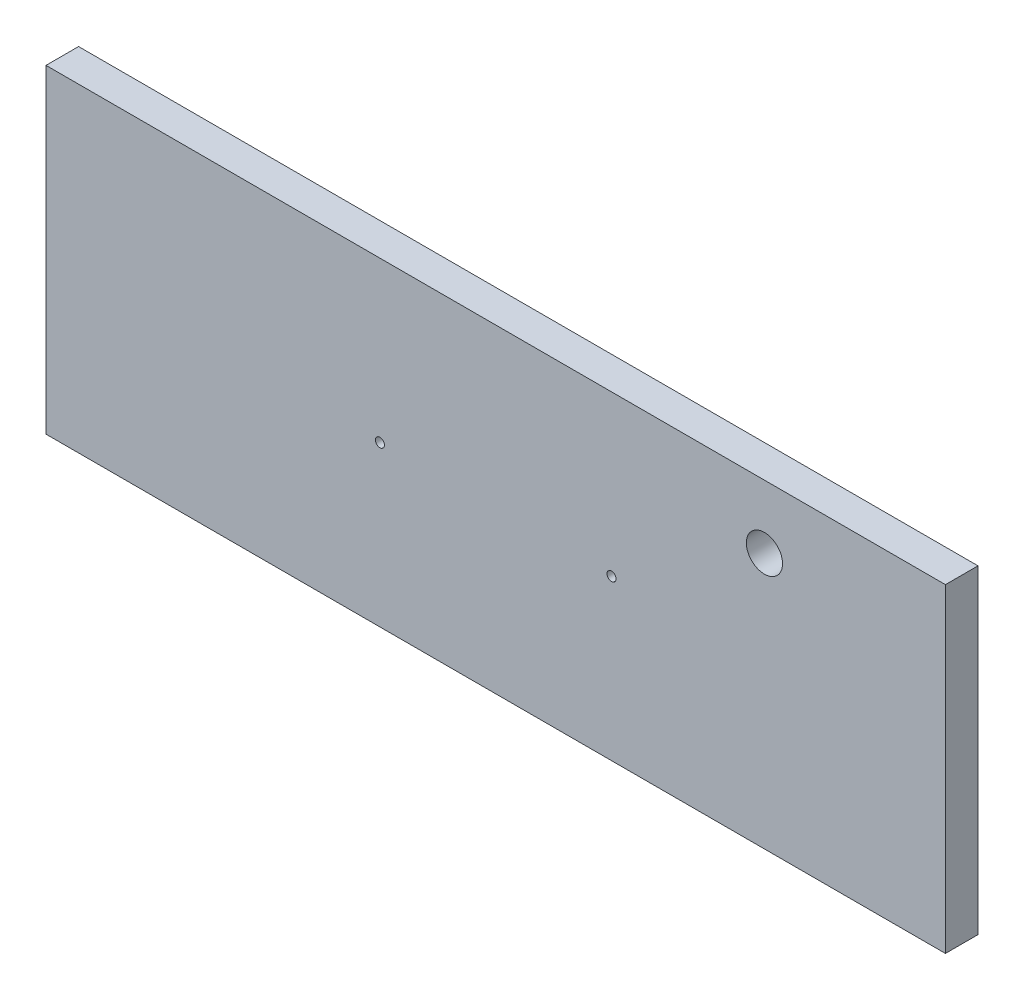
ISO-10303-21;
HEADER;
FILE_DESCRIPTION(('STEP AP214'),'2;1');
FILE_NAME('part.step','',(''),(''),'','','');
FILE_SCHEMA(('AUTOMOTIVE_DESIGN { 1 0 10303 214 1 1 1 1 }'));
ENDSEC;
DATA;
#1=APPLICATION_CONTEXT('core data for automotive mechanical design processes');
#2=APPLICATION_PROTOCOL_DEFINITION('international standard','automotive_design',2000,#1);
#3=PRODUCT_CONTEXT('',#1,'mechanical');
#4=PRODUCT('Part','Part','',(#3));
#5=PRODUCT_RELATED_PRODUCT_CATEGORY('part','',(#4));
#6=PRODUCT_DEFINITION_FORMATION('','',#4);
#7=PRODUCT_DEFINITION_CONTEXT('part definition',#1,'design');
#8=PRODUCT_DEFINITION('design','',#6,#7);
#9=PRODUCT_DEFINITION_SHAPE('','',#8);
#10=(LENGTH_UNIT() NAMED_UNIT(*) SI_UNIT(.MILLI.,.METRE.));
#11=(NAMED_UNIT(*) PLANE_ANGLE_UNIT() SI_UNIT($,.RADIAN.));
#12=(NAMED_UNIT(*) SI_UNIT($,.STERADIAN.) SOLID_ANGLE_UNIT());
#13=UNCERTAINTY_MEASURE_WITH_UNIT(LENGTH_MEASURE(1.E-05),#10,'distance_accuracy_value','');
#14=(GEOMETRIC_REPRESENTATION_CONTEXT(3) GLOBAL_UNCERTAINTY_ASSIGNED_CONTEXT((#13)) GLOBAL_UNIT_ASSIGNED_CONTEXT((#10,
#11,#12)) REPRESENTATION_CONTEXT('',''));
#15=CARTESIAN_POINT('',(0.,0.,0.));
#16=DIRECTION('',(0.,0.,1.));
#17=DIRECTION('',(1.,0.,0.));
#18=AXIS2_PLACEMENT_3D('',#15,#16,#17);
#19=CARTESIAN_POINT('',(248.5,-211.5,18.));
#20=DIRECTION('',(-1.,0.,0.));
#21=DIRECTION('',(0.,0.,1.));
#22=AXIS2_PLACEMENT_3D('',#19,#20,#21);
#23=PLANE('',#22);
#24=DIRECTION('',(0.,1.,0.));
#25=VECTOR('',#24,1.);
#26=CARTESIAN_POINT('',(248.5,-211.5,0.));
#27=LINE('',#26,#25);
#28=CARTESIAN_POINT('',(248.5,-211.5,0.));
#29=VERTEX_POINT('',#28);
#30=CARTESIAN_POINT('',(248.5,-35.,0.));
#31=VERTEX_POINT('',#30);
#32=EDGE_CURVE('E96',#29,#31,#27,.T.);
#33=ORIENTED_EDGE('',*,*,#32,.T.);
#34=DIRECTION('',(0.,0.,-1.));
#35=VECTOR('',#34,1.);
#36=CARTESIAN_POINT('',(248.5,-35.,18.));
#37=LINE('',#36,#35);
#38=CARTESIAN_POINT('',(248.5,-35.,18.));
#39=VERTEX_POINT('',#38);
#40=EDGE_CURVE('E11',#39,#31,#37,.T.);
#41=ORIENTED_EDGE('',*,*,#40,.F.);
#42=DIRECTION('',(0.,1.,0.));
#43=VECTOR('',#42,1.);
#44=CARTESIAN_POINT('',(248.5,-211.5,18.));
#45=LINE('',#44,#43);
#46=CARTESIAN_POINT('',(248.5,-211.5,18.));
#47=VERTEX_POINT('',#46);
#48=EDGE_CURVE('E84',#47,#39,#45,.T.);
#49=ORIENTED_EDGE('',*,*,#48,.F.);
#50=DIRECTION('',(0.,0.,-1.));
#51=VECTOR('',#50,1.);
#52=CARTESIAN_POINT('',(248.5,-211.5,18.));
#53=LINE('',#52,#51);
#54=EDGE_CURVE('E92',#47,#29,#53,.T.);
#55=ORIENTED_EDGE('',*,*,#54,.T.);
#56=EDGE_LOOP('',(#33,#41,#49,#55));
#57=FACE_BOUND('',#56,.T.);
#58=ADVANCED_FACE('F33',(#57),#23,.F.);
#59=CARTESIAN_POINT('',(248.5,-35.,18.));
#60=DIRECTION('',(0.,-1.,0.));
#61=DIRECTION('',(1.,0.,0.));
#62=AXIS2_PLACEMENT_3D('',#59,#60,#61);
#63=PLANE('',#62);
#64=DIRECTION('',(-1.,0.,0.));
#65=VECTOR('',#64,1.);
#66=CARTESIAN_POINT('',(248.5,-35.,0.));
#67=LINE('',#66,#65);
#68=CARTESIAN_POINT('',(-248.5,-35.0000000000001,0.));
#69=VERTEX_POINT('',#68);
#70=EDGE_CURVE('E88',#31,#69,#67,.T.);
#71=ORIENTED_EDGE('',*,*,#70,.T.);
#72=DIRECTION('',(0.,0.,-1.));
#73=VECTOR('',#72,1.);
#74=CARTESIAN_POINT('',(-248.5,-35.0000000000001,18.));
#75=LINE('',#74,#73);
#76=CARTESIAN_POINT('',(-248.5,-35.0000000000001,18.));
#77=VERTEX_POINT('',#76);
#78=EDGE_CURVE('E41',#77,#69,#75,.T.);
#79=ORIENTED_EDGE('',*,*,#78,.F.);
#80=DIRECTION('',(-1.,0.,0.));
#81=VECTOR('',#80,1.);
#82=CARTESIAN_POINT('',(248.5,-35.,18.));
#83=LINE('',#82,#81);
#84=EDGE_CURVE('E79',#39,#77,#83,.T.);
#85=ORIENTED_EDGE('',*,*,#84,.F.);
#86=ORIENTED_EDGE('',*,*,#40,.T.);
#87=EDGE_LOOP('',(#71,#79,#85,#86));
#88=FACE_BOUND('',#87,.T.);
#89=ADVANCED_FACE('F87',(#88),#63,.F.);
#90=CARTESIAN_POINT('',(-248.5,-211.5,18.));
#91=DIRECTION('',(1.,0.,0.));
#92=DIRECTION('',(0.,0.,-1.));
#93=AXIS2_PLACEMENT_3D('',#90,#91,#92);
#94=PLANE('',#93);
#95=DIRECTION('',(0.,-1.,0.));
#96=VECTOR('',#95,1.);
#97=CARTESIAN_POINT('',(-248.5,-211.5,0.));
#98=LINE('',#97,#96);
#99=CARTESIAN_POINT('',(-248.5,-211.5,0.));
#100=VERTEX_POINT('',#99);
#101=EDGE_CURVE('E66',#69,#100,#98,.T.);
#102=ORIENTED_EDGE('',*,*,#101,.T.);
#103=DIRECTION('',(0.,0.,-1.));
#104=VECTOR('',#103,1.);
#105=CARTESIAN_POINT('',(-248.5,-211.5,18.));
#106=LINE('',#105,#104);
#107=CARTESIAN_POINT('',(-248.5,-211.5,18.));
#108=VERTEX_POINT('',#107);
#109=EDGE_CURVE('E89',#108,#100,#106,.T.);
#110=ORIENTED_EDGE('',*,*,#109,.F.);
#111=DIRECTION('',(0.,-1.,0.));
#112=VECTOR('',#111,1.);
#113=CARTESIAN_POINT('',(-248.5,-211.5,18.));
#114=LINE('',#113,#112);
#115=EDGE_CURVE('E82',#77,#108,#114,.T.);
#116=ORIENTED_EDGE('',*,*,#115,.F.);
#117=ORIENTED_EDGE('',*,*,#78,.T.);
#118=EDGE_LOOP('',(#102,#110,#116,#117));
#119=FACE_BOUND('',#118,.T.);
#120=ADVANCED_FACE('F90',(#119),#94,.F.);
#121=CARTESIAN_POINT('',(248.5,-211.5,18.));
#122=DIRECTION('',(0.,1.,0.));
#123=DIRECTION('',(-1.,0.,0.));
#124=AXIS2_PLACEMENT_3D('',#121,#122,#123);
#125=PLANE('',#124);
#126=DIRECTION('',(1.,0.,0.));
#127=VECTOR('',#126,1.);
#128=CARTESIAN_POINT('',(248.5,-211.5,0.));
#129=LINE('',#128,#127);
#130=EDGE_CURVE('E72',#100,#29,#129,.T.);
#131=ORIENTED_EDGE('',*,*,#130,.T.);
#132=ORIENTED_EDGE('',*,*,#54,.F.);
#133=DIRECTION('',(1.,0.,0.));
#134=VECTOR('',#133,1.);
#135=CARTESIAN_POINT('',(248.5,-211.5,18.));
#136=LINE('',#135,#134);
#137=EDGE_CURVE('E49',#108,#47,#136,.T.);
#138=ORIENTED_EDGE('',*,*,#137,.F.);
#139=ORIENTED_EDGE('',*,*,#109,.T.);
#140=EDGE_LOOP('',(#131,#132,#138,#139));
#141=FACE_BOUND('',#140,.T.);
#142=ADVANCED_FACE('F104',(#141),#125,.F.);
#143=CARTESIAN_POINT('',(0.,0.,18.));
#144=DIRECTION('',(0.,0.,1.));
#145=DIRECTION('',(1.,0.,0.));
#146=AXIS2_PLACEMENT_3D('',#143,#144,#145);
#147=PLANE('',#146);
#148=CARTESIAN_POINT('',(148.5,-70.,18.));
#149=DIRECTION('',(0.,0.,1.));
#150=DIRECTION('',(1.,0.,0.));
#151=AXIS2_PLACEMENT_3D('',#148,#149,#150);
#152=CIRCLE('',#151,9.99999999999998);
#153=CARTESIAN_POINT('',(158.5,-70.,18.));
#154=VERTEX_POINT('',#153);
#155=EDGE_CURVE('E122',#154,#154,#152,.T.);
#156=ORIENTED_EDGE('',*,*,#155,.F.);
#157=EDGE_LOOP('',(#156));
#158=FACE_BOUND('',#157,.T.);
#159=CARTESIAN_POINT('',(-64.,-123.25,18.));
#160=DIRECTION('',(0.,0.,1.));
#161=DIRECTION('',(-1.,0.,0.));
#162=AXIS2_PLACEMENT_3D('',#159,#160,#161);
#163=CIRCLE('',#162,2.49999999999976);
#164=CARTESIAN_POINT('',(-66.4999999999997,-123.25,18.));
#165=VERTEX_POINT('',#164);
#166=EDGE_CURVE('E116',#165,#165,#163,.T.);
#167=ORIENTED_EDGE('',*,*,#166,.F.);
#168=EDGE_LOOP('',(#167));
#169=FACE_BOUND('',#168,.T.);
#170=CARTESIAN_POINT('',(64.,-123.25,18.));
#171=DIRECTION('',(0.,0.,1.));
#172=DIRECTION('',(1.,0.,0.));
#173=AXIS2_PLACEMENT_3D('',#170,#171,#172);
#174=CIRCLE('',#173,2.49999999999981);
#175=CARTESIAN_POINT('',(66.4999999999998,-123.25,18.));
#176=VERTEX_POINT('',#175);
#177=EDGE_CURVE('E110',#176,#176,#174,.T.);
#178=ORIENTED_EDGE('',*,*,#177,.F.);
#179=EDGE_LOOP('',(#178));
#180=FACE_BOUND('',#179,.T.);
#181=ORIENTED_EDGE('',*,*,#48,.T.);
#182=ORIENTED_EDGE('',*,*,#84,.T.);
#183=ORIENTED_EDGE('',*,*,#115,.T.);
#184=ORIENTED_EDGE('',*,*,#137,.T.);
#185=EDGE_LOOP('',(#181,#182,#183,#184));
#186=FACE_BOUND('',#185,.T.);
#187=ADVANCED_FACE('F80',(#158,#169,#180,#186),#147,.T.);
#188=CARTESIAN_POINT('',(0.,0.,0.));
#189=DIRECTION('',(0.,0.,1.));
#190=DIRECTION('',(1.,0.,0.));
#191=AXIS2_PLACEMENT_3D('',#188,#189,#190);
#192=PLANE('',#191);
#193=CARTESIAN_POINT('',(148.5,-70.,0.));
#194=DIRECTION('',(0.,0.,1.));
#195=DIRECTION('',(1.,0.,0.));
#196=AXIS2_PLACEMENT_3D('',#193,#194,#195);
#197=CIRCLE('',#196,9.99999999999998);
#198=CARTESIAN_POINT('',(158.5,-70.,0.));
#199=VERTEX_POINT('',#198);
#200=EDGE_CURVE('E119',#199,#199,#197,.T.);
#201=ORIENTED_EDGE('',*,*,#200,.T.);
#202=EDGE_LOOP('',(#201));
#203=FACE_BOUND('',#202,.T.);
#204=CARTESIAN_POINT('',(-64.,-123.25,0.));
#205=DIRECTION('',(0.,0.,1.));
#206=DIRECTION('',(-1.,0.,0.));
#207=AXIS2_PLACEMENT_3D('',#204,#205,#206);
#208=CIRCLE('',#207,2.49999999999976);
#209=CARTESIAN_POINT('',(-66.4999999999997,-123.25,0.));
#210=VERTEX_POINT('',#209);
#211=EDGE_CURVE('E113',#210,#210,#208,.T.);
#212=ORIENTED_EDGE('',*,*,#211,.T.);
#213=EDGE_LOOP('',(#212));
#214=FACE_BOUND('',#213,.T.);
#215=CARTESIAN_POINT('',(64.,-123.25,0.));
#216=DIRECTION('',(0.,0.,1.));
#217=DIRECTION('',(1.,0.,0.));
#218=AXIS2_PLACEMENT_3D('',#215,#216,#217);
#219=CIRCLE('',#218,2.49999999999981);
#220=CARTESIAN_POINT('',(66.4999999999998,-123.25,0.));
#221=VERTEX_POINT('',#220);
#222=EDGE_CURVE('E99',#221,#221,#219,.T.);
#223=ORIENTED_EDGE('',*,*,#222,.T.);
#224=EDGE_LOOP('',(#223));
#225=FACE_BOUND('',#224,.T.);
#226=ORIENTED_EDGE('',*,*,#32,.F.);
#227=ORIENTED_EDGE('',*,*,#130,.F.);
#228=ORIENTED_EDGE('',*,*,#101,.F.);
#229=ORIENTED_EDGE('',*,*,#70,.F.);
#230=EDGE_LOOP('',(#226,#227,#228,#229));
#231=FACE_BOUND('',#230,.T.);
#232=ADVANCED_FACE('F107',(#203,#214,#225,#231),#192,.F.);
#233=CARTESIAN_POINT('',(64.,-123.25,0.));
#234=DIRECTION('',(0.,0.,1.));
#235=DIRECTION('',(1.,0.,0.));
#236=AXIS2_PLACEMENT_3D('',#233,#234,#235);
#237=CYLINDRICAL_SURFACE('',#236,2.49999999999981);
#238=ORIENTED_EDGE('',*,*,#222,.F.);
#239=EDGE_LOOP('',(#238));
#240=FACE_BOUND('',#239,.T.);
#241=ORIENTED_EDGE('',*,*,#177,.T.);
#242=EDGE_LOOP('',(#241));
#243=FACE_BOUND('',#242,.T.);
#244=ADVANCED_FACE('F144',(#240,#243),#237,.F.);
#245=CARTESIAN_POINT('',(-64.,-123.25,0.));
#246=DIRECTION('',(0.,0.,1.));
#247=DIRECTION('',(1.,0.,0.));
#248=AXIS2_PLACEMENT_3D('',#245,#246,#247);
#249=CYLINDRICAL_SURFACE('',#248,2.49999999999976);
#250=ORIENTED_EDGE('',*,*,#211,.F.);
#251=EDGE_LOOP('',(#250));
#252=FACE_BOUND('',#251,.T.);
#253=ORIENTED_EDGE('',*,*,#166,.T.);
#254=EDGE_LOOP('',(#253));
#255=FACE_BOUND('',#254,.T.);
#256=ADVANCED_FACE('F133',(#252,#255),#249,.F.);
#257=CARTESIAN_POINT('',(148.5,-70.,0.));
#258=DIRECTION('',(0.,0.,1.));
#259=DIRECTION('',(1.,0.,0.));
#260=AXIS2_PLACEMENT_3D('',#257,#258,#259);
#261=CYLINDRICAL_SURFACE('',#260,9.99999999999998);
#262=ORIENTED_EDGE('',*,*,#200,.F.);
#263=EDGE_LOOP('',(#262));
#264=FACE_BOUND('',#263,.T.);
#265=ORIENTED_EDGE('',*,*,#155,.T.);
#266=EDGE_LOOP('',(#265));
#267=FACE_BOUND('',#266,.T.);
#268=ADVANCED_FACE('F130',(#264,#267),#261,.F.);
#269=CLOSED_SHELL('',(#58,#89,#120,#142,#187,#232,#244,#256,#268));
#270=MANIFOLD_SOLID_BREP('B2',#269);
#271=ADVANCED_BREP_SHAPE_REPRESENTATION('',(#18,#270),#14);
#272=SHAPE_DEFINITION_REPRESENTATION(#9,#271);
ENDSEC;
END-ISO-10303-21;
